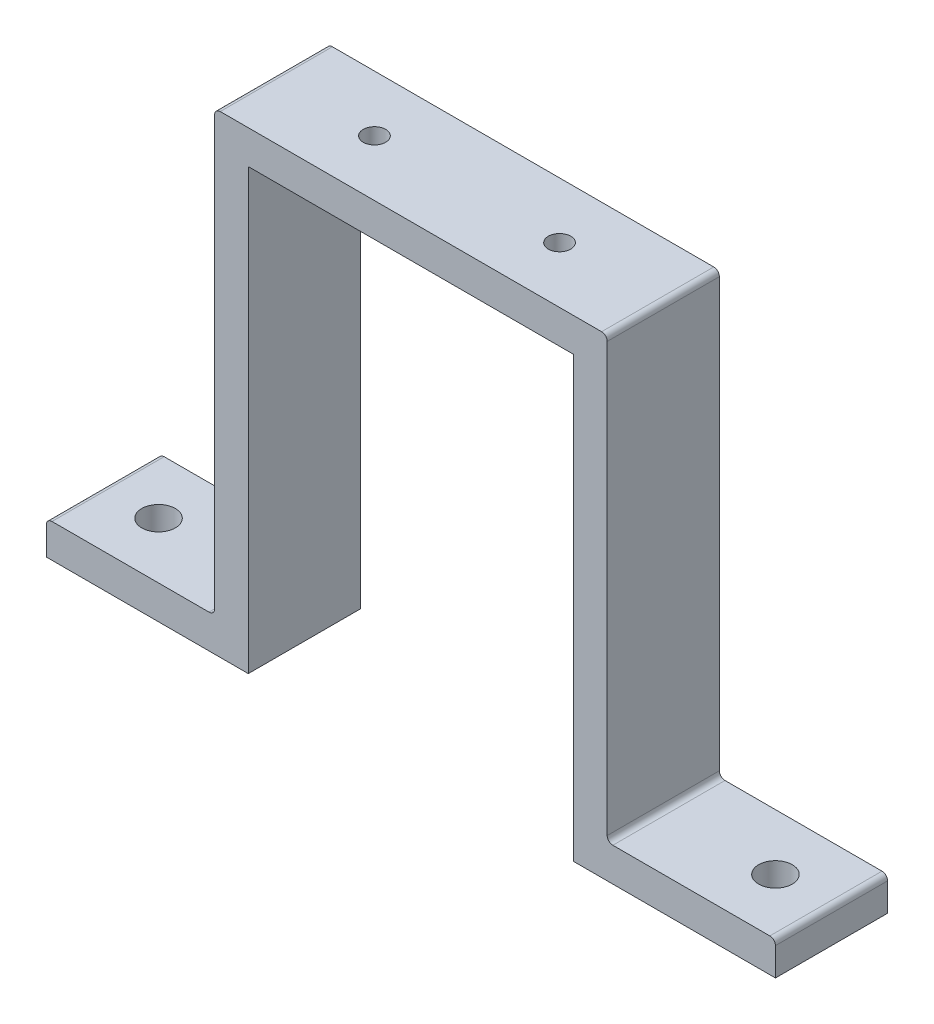
ISO-10303-21;
HEADER;
FILE_DESCRIPTION(('STEP AP214'),'2;1');
FILE_NAME('part.step','',(''),(''),'','','');
FILE_SCHEMA(('AUTOMOTIVE_DESIGN { 1 0 10303 214 1 1 1 1 }'));
ENDSEC;
DATA;
#1=APPLICATION_CONTEXT('core data for automotive mechanical design processes');
#2=APPLICATION_PROTOCOL_DEFINITION('international standard','automotive_design',2000,#1);
#3=PRODUCT_CONTEXT('',#1,'mechanical');
#4=PRODUCT('Part','Part','',(#3));
#5=PRODUCT_RELATED_PRODUCT_CATEGORY('part','',(#4));
#6=PRODUCT_DEFINITION_FORMATION('','',#4);
#7=PRODUCT_DEFINITION_CONTEXT('part definition',#1,'design');
#8=PRODUCT_DEFINITION('design','',#6,#7);
#9=PRODUCT_DEFINITION_SHAPE('','',#8);
#10=(LENGTH_UNIT() NAMED_UNIT(*) SI_UNIT(.MILLI.,.METRE.));
#11=(NAMED_UNIT(*) PLANE_ANGLE_UNIT() SI_UNIT($,.RADIAN.));
#12=(NAMED_UNIT(*) SI_UNIT($,.STERADIAN.) SOLID_ANGLE_UNIT());
#13=UNCERTAINTY_MEASURE_WITH_UNIT(LENGTH_MEASURE(1.E-05),#10,'distance_accuracy_value','');
#14=(GEOMETRIC_REPRESENTATION_CONTEXT(3) GLOBAL_UNCERTAINTY_ASSIGNED_CONTEXT((#13)) GLOBAL_UNIT_ASSIGNED_CONTEXT((#10,
#11,#12)) REPRESENTATION_CONTEXT('',''));
#15=CARTESIAN_POINT('',(0.,0.,0.));
#16=DIRECTION('',(0.,0.,1.));
#17=DIRECTION('',(1.,0.,0.));
#18=AXIS2_PLACEMENT_3D('',#15,#16,#17);
#19=CARTESIAN_POINT('',(-32.5,-36.15,10.));
#20=DIRECTION('',(1.,0.,0.));
#21=DIRECTION('',(0.,0.,-1.));
#22=AXIS2_PLACEMENT_3D('',#19,#20,#21);
#23=PLANE('',#22);
#24=DIRECTION('',(0.,-1.,0.));
#25=VECTOR('',#24,1.);
#26=CARTESIAN_POINT('',(-32.5,-36.15,10.));
#27=LINE('',#26,#25);
#28=CARTESIAN_POINT('',(-32.5,-36.65,10.));
#29=VERTEX_POINT('',#28);
#30=CARTESIAN_POINT('',(-32.5,-39.15,10.));
#31=VERTEX_POINT('',#30);
#32=EDGE_CURVE('E160',#29,#31,#27,.T.);
#33=ORIENTED_EDGE('',*,*,#32,.F.);
#34=DIRECTION('',(0.,0.,-1.));
#35=VECTOR('',#34,1.);
#36=CARTESIAN_POINT('',(-32.5,-36.65,10.));
#37=LINE('',#36,#35);
#38=CARTESIAN_POINT('',(-32.5,-36.65,0.));
#39=VERTEX_POINT('',#38);
#40=EDGE_CURVE('E186',#29,#39,#37,.T.);
#41=ORIENTED_EDGE('',*,*,#40,.T.);
#42=DIRECTION('',(0.,-1.,0.));
#43=VECTOR('',#42,1.);
#44=CARTESIAN_POINT('',(-32.5,-36.15,0.));
#45=LINE('',#44,#43);
#46=CARTESIAN_POINT('',(-32.5,-39.15,0.));
#47=VERTEX_POINT('',#46);
#48=EDGE_CURVE('E184',#39,#47,#45,.T.);
#49=ORIENTED_EDGE('',*,*,#48,.T.);
#50=DIRECTION('',(0.,0.,-1.));
#51=VECTOR('',#50,1.);
#52=CARTESIAN_POINT('',(-32.5,-39.15,10.));
#53=LINE('',#52,#51);
#54=EDGE_CURVE('E177',#31,#47,#53,.T.);
#55=ORIENTED_EDGE('',*,*,#54,.F.);
#56=EDGE_LOOP('',(#33,#41,#49,#55));
#57=FACE_BOUND('',#56,.T.);
#58=ADVANCED_FACE('F36',(#57),#23,.F.);
#59=CARTESIAN_POINT('',(-32.5,-39.15,10.));
#60=DIRECTION('',(0.,1.,0.));
#61=DIRECTION('',(0.,0.,1.));
#62=AXIS2_PLACEMENT_3D('',#59,#60,#61);
#63=PLANE('',#62);
#64=CARTESIAN_POINT('',(-27.5,-39.15,5.));
#65=DIRECTION('',(0.,1.,0.));
#66=DIRECTION('',(0.,0.,1.));
#67=AXIS2_PLACEMENT_3D('',#64,#65,#66);
#68=CIRCLE('',#67,1.5);
#69=CARTESIAN_POINT('',(-29.,-39.15,5.));
#70=VERTEX_POINT('',#69);
#71=EDGE_CURVE('E342',#70,#70,#68,.F.);
#72=ORIENTED_EDGE('',*,*,#71,.F.);
#73=EDGE_LOOP('',(#72));
#74=FACE_BOUND('',#73,.T.);
#75=DIRECTION('',(1.,0.,0.));
#76=VECTOR('',#75,1.);
#77=CARTESIAN_POINT('',(-32.5,-39.15,0.));
#78=LINE('',#77,#76);
#79=CARTESIAN_POINT('',(-14.5,-39.15,0.));
#80=VERTEX_POINT('',#79);
#81=EDGE_CURVE('E277',#47,#80,#78,.T.);
#82=ORIENTED_EDGE('',*,*,#81,.T.);
#83=DIRECTION('',(0.,0.,-1.));
#84=VECTOR('',#83,1.);
#85=CARTESIAN_POINT('',(-14.5,-39.15,10.));
#86=LINE('',#85,#84);
#87=CARTESIAN_POINT('',(-14.5,-39.15,10.));
#88=VERTEX_POINT('',#87);
#89=EDGE_CURVE('E179',#88,#80,#86,.T.);
#90=ORIENTED_EDGE('',*,*,#89,.F.);
#91=DIRECTION('',(1.,0.,0.));
#92=VECTOR('',#91,1.);
#93=CARTESIAN_POINT('',(-32.5,-39.15,10.));
#94=LINE('',#93,#92);
#95=EDGE_CURVE('E164',#31,#88,#94,.T.);
#96=ORIENTED_EDGE('',*,*,#95,.F.);
#97=ORIENTED_EDGE('',*,*,#54,.T.);
#98=EDGE_LOOP('',(#82,#90,#96,#97));
#99=FACE_BOUND('',#98,.T.);
#100=ADVANCED_FACE('F176',(#74,#99),#63,.F.);
#101=CARTESIAN_POINT('',(-14.5,-39.15,10.));
#102=DIRECTION('',(-1.,0.,0.));
#103=DIRECTION('',(0.,0.,1.));
#104=AXIS2_PLACEMENT_3D('',#101,#102,#103);
#105=PLANE('',#104);
#106=DIRECTION('',(0.,1.,0.));
#107=VECTOR('',#106,1.);
#108=CARTESIAN_POINT('',(-14.5,-39.15,0.));
#109=LINE('',#108,#107);
#110=CARTESIAN_POINT('',(-14.5,0.,0.));
#111=VERTEX_POINT('',#110);
#112=EDGE_CURVE('E280',#80,#111,#109,.T.);
#113=ORIENTED_EDGE('',*,*,#112,.T.);
#114=DIRECTION('',(0.,0.,-1.));
#115=VECTOR('',#114,1.);
#116=CARTESIAN_POINT('',(-14.5,0.,10.));
#117=LINE('',#116,#115);
#118=CARTESIAN_POINT('',(-14.5,0.,10.));
#119=VERTEX_POINT('',#118);
#120=EDGE_CURVE('E190',#119,#111,#117,.T.);
#121=ORIENTED_EDGE('',*,*,#120,.F.);
#122=DIRECTION('',(0.,1.,0.));
#123=VECTOR('',#122,1.);
#124=CARTESIAN_POINT('',(-14.5,-39.15,10.));
#125=LINE('',#124,#123);
#126=EDGE_CURVE('E181',#88,#119,#125,.T.);
#127=ORIENTED_EDGE('',*,*,#126,.F.);
#128=ORIENTED_EDGE('',*,*,#89,.T.);
#129=EDGE_LOOP('',(#113,#121,#127,#128));
#130=FACE_BOUND('',#129,.T.);
#131=ADVANCED_FACE('F373',(#130),#105,.F.);
#132=CARTESIAN_POINT('',(-14.5,0.,10.));
#133=DIRECTION('',(0.,1.,0.));
#134=DIRECTION('',(-1.,0.,0.));
#135=AXIS2_PLACEMENT_3D('',#132,#133,#134);
#136=PLANE('',#135);
#137=CARTESIAN_POINT('',(-8.25,0.,5.));
#138=DIRECTION('',(0.,1.,0.));
#139=DIRECTION('',(-1.,0.,0.));
#140=AXIS2_PLACEMENT_3D('',#137,#138,#139);
#141=CIRCLE('',#140,1.);
#142=CARTESIAN_POINT('',(-9.25,0.,5.));
#143=VERTEX_POINT('',#142);
#144=EDGE_CURVE('E278',#143,#143,#141,.F.);
#145=ORIENTED_EDGE('',*,*,#144,.F.);
#146=EDGE_LOOP('',(#145));
#147=FACE_BOUND('',#146,.T.);
#148=CARTESIAN_POINT('',(8.25,0.,5.));
#149=DIRECTION('',(0.,1.,0.));
#150=DIRECTION('',(-1.,0.,0.));
#151=AXIS2_PLACEMENT_3D('',#148,#149,#150);
#152=CIRCLE('',#151,1.);
#153=CARTESIAN_POINT('',(7.25,0.,5.));
#154=VERTEX_POINT('',#153);
#155=EDGE_CURVE('E335',#154,#154,#152,.F.);
#156=ORIENTED_EDGE('',*,*,#155,.F.);
#157=EDGE_LOOP('',(#156));
#158=FACE_BOUND('',#157,.T.);
#159=DIRECTION('',(1.,0.,0.));
#160=VECTOR('',#159,1.);
#161=CARTESIAN_POINT('',(-14.5,0.,0.));
#162=LINE('',#161,#160);
#163=CARTESIAN_POINT('',(14.5,0.,0.));
#164=VERTEX_POINT('',#163);
#165=EDGE_CURVE('E282',#111,#164,#162,.T.);
#166=ORIENTED_EDGE('',*,*,#165,.T.);
#167=DIRECTION('',(0.,0.,-1.));
#168=VECTOR('',#167,1.);
#169=CARTESIAN_POINT('',(14.5,0.,10.));
#170=LINE('',#169,#168);
#171=CARTESIAN_POINT('',(14.5,0.,10.));
#172=VERTEX_POINT('',#171);
#173=EDGE_CURVE('E303',#172,#164,#170,.T.);
#174=ORIENTED_EDGE('',*,*,#173,.F.);
#175=DIRECTION('',(1.,0.,0.));
#176=VECTOR('',#175,1.);
#177=CARTESIAN_POINT('',(-14.5,0.,10.));
#178=LINE('',#177,#176);
#179=EDGE_CURVE('E312',#119,#172,#178,.T.);
#180=ORIENTED_EDGE('',*,*,#179,.F.);
#181=ORIENTED_EDGE('',*,*,#120,.T.);
#182=EDGE_LOOP('',(#166,#174,#180,#181));
#183=FACE_BOUND('',#182,.T.);
#184=ADVANCED_FACE('F310',(#147,#158,#183),#136,.F.);
#185=CARTESIAN_POINT('',(14.5,0.,10.));
#186=DIRECTION('',(1.,0.,0.));
#187=DIRECTION('',(0.,0.,-1.));
#188=AXIS2_PLACEMENT_3D('',#185,#186,#187);
#189=PLANE('',#188);
#190=DIRECTION('',(0.,-1.,0.));
#191=VECTOR('',#190,1.);
#192=CARTESIAN_POINT('',(14.5,0.,0.));
#193=LINE('',#192,#191);
#194=CARTESIAN_POINT('',(14.5,-39.15,0.));
#195=VERTEX_POINT('',#194);
#196=EDGE_CURVE('E284',#164,#195,#193,.T.);
#197=ORIENTED_EDGE('',*,*,#196,.T.);
#198=DIRECTION('',(0.,0.,-1.));
#199=VECTOR('',#198,1.);
#200=CARTESIAN_POINT('',(14.5,-39.15,10.));
#201=LINE('',#200,#199);
#202=CARTESIAN_POINT('',(14.5,-39.15,10.));
#203=VERTEX_POINT('',#202);
#204=EDGE_CURVE('E300',#203,#195,#201,.T.);
#205=ORIENTED_EDGE('',*,*,#204,.F.);
#206=DIRECTION('',(0.,-1.,0.));
#207=VECTOR('',#206,1.);
#208=CARTESIAN_POINT('',(14.5,0.,10.));
#209=LINE('',#208,#207);
#210=EDGE_CURVE('E329',#172,#203,#209,.T.);
#211=ORIENTED_EDGE('',*,*,#210,.F.);
#212=ORIENTED_EDGE('',*,*,#173,.T.);
#213=EDGE_LOOP('',(#197,#205,#211,#212));
#214=FACE_BOUND('',#213,.T.);
#215=ADVANCED_FACE('F320',(#214),#189,.F.);
#216=CARTESIAN_POINT('',(32.5,-39.15,10.));
#217=DIRECTION('',(0.,1.,0.));
#218=DIRECTION('',(0.,0.,1.));
#219=AXIS2_PLACEMENT_3D('',#216,#217,#218);
#220=PLANE('',#219);
#221=CARTESIAN_POINT('',(27.5,-39.15,5.));
#222=DIRECTION('',(0.,1.,0.));
#223=DIRECTION('',(0.,0.,1.));
#224=AXIS2_PLACEMENT_3D('',#221,#222,#223);
#225=CIRCLE('',#224,1.5);
#226=CARTESIAN_POINT('',(26.,-39.15,5.));
#227=VERTEX_POINT('',#226);
#228=EDGE_CURVE('E351',#227,#227,#225,.F.);
#229=ORIENTED_EDGE('',*,*,#228,.F.);
#230=EDGE_LOOP('',(#229));
#231=FACE_BOUND('',#230,.T.);
#232=DIRECTION('',(1.,0.,0.));
#233=VECTOR('',#232,1.);
#234=CARTESIAN_POINT('',(32.5,-39.15,0.));
#235=LINE('',#234,#233);
#236=CARTESIAN_POINT('',(32.5,-39.15,0.));
#237=VERTEX_POINT('',#236);
#238=EDGE_CURVE('E286',#195,#237,#235,.T.);
#239=ORIENTED_EDGE('',*,*,#238,.T.);
#240=DIRECTION('',(0.,0.,-1.));
#241=VECTOR('',#240,1.);
#242=CARTESIAN_POINT('',(32.5,-39.15,10.));
#243=LINE('',#242,#241);
#244=CARTESIAN_POINT('',(32.5,-39.15,10.));
#245=VERTEX_POINT('',#244);
#246=EDGE_CURVE('E275',#245,#237,#243,.T.);
#247=ORIENTED_EDGE('',*,*,#246,.F.);
#248=DIRECTION('',(1.,0.,0.));
#249=VECTOR('',#248,1.);
#250=CARTESIAN_POINT('',(32.5,-39.15,10.));
#251=LINE('',#250,#249);
#252=EDGE_CURVE('E326',#203,#245,#251,.T.);
#253=ORIENTED_EDGE('',*,*,#252,.F.);
#254=ORIENTED_EDGE('',*,*,#204,.T.);
#255=EDGE_LOOP('',(#239,#247,#253,#254));
#256=FACE_BOUND('',#255,.T.);
#257=ADVANCED_FACE('F324',(#231,#256),#220,.F.);
#258=CARTESIAN_POINT('',(32.5,-36.15,10.));
#259=DIRECTION('',(-1.,0.,0.));
#260=DIRECTION('',(0.,0.,1.));
#261=AXIS2_PLACEMENT_3D('',#258,#259,#260);
#262=PLANE('',#261);
#263=DIRECTION('',(0.,1.,0.));
#264=VECTOR('',#263,1.);
#265=CARTESIAN_POINT('',(32.5,-36.15,0.));
#266=LINE('',#265,#264);
#267=CARTESIAN_POINT('',(32.5,-36.65,0.));
#268=VERTEX_POINT('',#267);
#269=EDGE_CURVE('E252',#237,#268,#266,.T.);
#270=ORIENTED_EDGE('',*,*,#269,.T.);
#271=DIRECTION('',(0.,0.,-1.));
#272=VECTOR('',#271,1.);
#273=CARTESIAN_POINT('',(32.5,-36.65,10.));
#274=LINE('',#273,#272);
#275=CARTESIAN_POINT('',(32.5,-36.65,10.));
#276=VERTEX_POINT('',#275);
#277=EDGE_CURVE('E217',#268,#276,#274,.F.);
#278=ORIENTED_EDGE('',*,*,#277,.T.);
#279=DIRECTION('',(0.,1.,0.));
#280=VECTOR('',#279,1.);
#281=CARTESIAN_POINT('',(32.5,-36.15,10.));
#282=LINE('',#281,#280);
#283=EDGE_CURVE('E268',#245,#276,#282,.T.);
#284=ORIENTED_EDGE('',*,*,#283,.F.);
#285=ORIENTED_EDGE('',*,*,#246,.T.);
#286=EDGE_LOOP('',(#270,#278,#284,#285));
#287=FACE_BOUND('',#286,.T.);
#288=ADVANCED_FACE('F432',(#287),#262,.F.);
#289=CARTESIAN_POINT('',(17.5,-36.15,10.));
#290=DIRECTION('',(0.,-1.,0.));
#291=DIRECTION('',(1.,0.,0.));
#292=AXIS2_PLACEMENT_3D('',#289,#290,#291);
#293=PLANE('',#292);
#294=CARTESIAN_POINT('',(27.5,-36.15,5.));
#295=DIRECTION('',(0.,1.,0.));
#296=DIRECTION('',(-1.,0.,0.));
#297=AXIS2_PLACEMENT_3D('',#294,#295,#296);
#298=CIRCLE('',#297,1.5);
#299=CARTESIAN_POINT('',(26.,-36.15,5.));
#300=VERTEX_POINT('',#299);
#301=EDGE_CURVE('E347',#300,#300,#298,.T.);
#302=ORIENTED_EDGE('',*,*,#301,.F.);
#303=EDGE_LOOP('',(#302));
#304=FACE_BOUND('',#303,.T.);
#305=DIRECTION('',(-1.,0.,0.));
#306=VECTOR('',#305,1.);
#307=CARTESIAN_POINT('',(17.5,-36.15,10.));
#308=LINE('',#307,#306);
#309=CARTESIAN_POINT('',(32.,-36.15,10.));
#310=VERTEX_POINT('',#309);
#311=CARTESIAN_POINT('',(18.,-36.15,10.));
#312=VERTEX_POINT('',#311);
#313=EDGE_CURVE('E260',#310,#312,#308,.T.);
#314=ORIENTED_EDGE('',*,*,#313,.F.);
#315=DIRECTION('',(0.,0.,-1.));
#316=VECTOR('',#315,1.);
#317=CARTESIAN_POINT('',(32.,-36.15,10.));
#318=LINE('',#317,#316);
#319=CARTESIAN_POINT('',(32.,-36.15,0.));
#320=VERTEX_POINT('',#319);
#321=EDGE_CURVE('E214',#310,#320,#318,.T.);
#322=ORIENTED_EDGE('',*,*,#321,.T.);
#323=DIRECTION('',(-1.,0.,0.));
#324=VECTOR('',#323,1.);
#325=CARTESIAN_POINT('',(17.5,-36.15,0.));
#326=LINE('',#325,#324);
#327=CARTESIAN_POINT('',(18.,-36.15,0.));
#328=VERTEX_POINT('',#327);
#329=EDGE_CURVE('E241',#320,#328,#326,.T.);
#330=ORIENTED_EDGE('',*,*,#329,.T.);
#331=DIRECTION('',(0.,0.,-1.));
#332=VECTOR('',#331,1.);
#333=CARTESIAN_POINT('',(18.,-36.15,10.));
#334=LINE('',#333,#332);
#335=EDGE_CURVE('E212',#328,#312,#334,.F.);
#336=ORIENTED_EDGE('',*,*,#335,.T.);
#337=EDGE_LOOP('',(#314,#322,#330,#336));
#338=FACE_BOUND('',#337,.T.);
#339=ADVANCED_FACE('F249',(#304,#338),#293,.F.);
#340=CARTESIAN_POINT('',(17.5,3.,10.));
#341=DIRECTION('',(-1.,0.,0.));
#342=DIRECTION('',(0.,-1.,0.));
#343=AXIS2_PLACEMENT_3D('',#340,#341,#342);
#344=PLANE('',#343);
#345=DIRECTION('',(0.,1.,0.));
#346=VECTOR('',#345,1.);
#347=CARTESIAN_POINT('',(17.5,3.,10.));
#348=LINE('',#347,#346);
#349=CARTESIAN_POINT('',(17.5,-35.65,10.));
#350=VERTEX_POINT('',#349);
#351=CARTESIAN_POINT('',(17.5,2.5,10.));
#352=VERTEX_POINT('',#351);
#353=EDGE_CURVE('E258',#350,#352,#348,.T.);
#354=ORIENTED_EDGE('',*,*,#353,.F.);
#355=DIRECTION('',(0.,0.,-1.));
#356=VECTOR('',#355,1.);
#357=CARTESIAN_POINT('',(17.5,-35.65,0.));
#358=LINE('',#357,#356);
#359=CARTESIAN_POINT('',(17.5,-35.65,0.));
#360=VERTEX_POINT('',#359);
#361=EDGE_CURVE('E230',#350,#360,#358,.T.);
#362=ORIENTED_EDGE('',*,*,#361,.T.);
#363=DIRECTION('',(0.,1.,0.));
#364=VECTOR('',#363,1.);
#365=CARTESIAN_POINT('',(17.5,3.,0.));
#366=LINE('',#365,#364);
#367=CARTESIAN_POINT('',(17.5,2.5,0.));
#368=VERTEX_POINT('',#367);
#369=EDGE_CURVE('E243',#360,#368,#366,.T.);
#370=ORIENTED_EDGE('',*,*,#369,.T.);
#371=DIRECTION('',(0.,0.,-1.));
#372=VECTOR('',#371,1.);
#373=CARTESIAN_POINT('',(17.5,2.5,10.));
#374=LINE('',#373,#372);
#375=EDGE_CURVE('E228',#368,#352,#374,.F.);
#376=ORIENTED_EDGE('',*,*,#375,.T.);
#377=EDGE_LOOP('',(#354,#362,#370,#376));
#378=FACE_BOUND('',#377,.T.);
#379=ADVANCED_FACE('F262',(#378),#344,.F.);
#380=CARTESIAN_POINT('',(17.5,3.,10.));
#381=DIRECTION('',(0.,-1.,0.));
#382=DIRECTION('',(0.,0.,-1.));
#383=AXIS2_PLACEMENT_3D('',#380,#381,#382);
#384=PLANE('',#383);
#385=CARTESIAN_POINT('',(-8.25,2.99999999999999,5.));
#386=DIRECTION('',(0.,1.,0.));
#387=DIRECTION('',(-1.,0.,0.));
#388=AXIS2_PLACEMENT_3D('',#385,#386,#387);
#389=CIRCLE('',#388,1.);
#390=CARTESIAN_POINT('',(-9.25,2.99999999999999,5.));
#391=VERTEX_POINT('',#390);
#392=EDGE_CURVE('E338',#391,#391,#389,.T.);
#393=ORIENTED_EDGE('',*,*,#392,.F.);
#394=EDGE_LOOP('',(#393));
#395=FACE_BOUND('',#394,.T.);
#396=CARTESIAN_POINT('',(8.25,3.,5.));
#397=DIRECTION('',(0.,1.,0.));
#398=DIRECTION('',(-1.,0.,0.));
#399=AXIS2_PLACEMENT_3D('',#396,#397,#398);
#400=CIRCLE('',#399,1.);
#401=CARTESIAN_POINT('',(7.25,3.,5.));
#402=VERTEX_POINT('',#401);
#403=EDGE_CURVE('E339',#402,#402,#400,.T.);
#404=ORIENTED_EDGE('',*,*,#403,.F.);
#405=EDGE_LOOP('',(#404));
#406=FACE_BOUND('',#405,.T.);
#407=DIRECTION('',(-1.,0.,0.));
#408=VECTOR('',#407,1.);
#409=CARTESIAN_POINT('',(17.5,3.,0.));
#410=LINE('',#409,#408);
#411=CARTESIAN_POINT('',(17.,3.,0.));
#412=VERTEX_POINT('',#411);
#413=CARTESIAN_POINT('',(-17.,3.,0.));
#414=VERTEX_POINT('',#413);
#415=EDGE_CURVE('E291',#412,#414,#410,.T.);
#416=ORIENTED_EDGE('',*,*,#415,.T.);
#417=DIRECTION('',(0.,0.,-1.));
#418=VECTOR('',#417,1.);
#419=CARTESIAN_POINT('',(-17.,3.,10.));
#420=LINE('',#419,#418);
#421=CARTESIAN_POINT('',(-17.,3.,10.));
#422=VERTEX_POINT('',#421);
#423=EDGE_CURVE('E226',#414,#422,#420,.F.);
#424=ORIENTED_EDGE('',*,*,#423,.T.);
#425=DIRECTION('',(-1.,0.,0.));
#426=VECTOR('',#425,1.);
#427=CARTESIAN_POINT('',(17.5,3.,10.));
#428=LINE('',#427,#426);
#429=CARTESIAN_POINT('',(17.,3.,10.));
#430=VERTEX_POINT('',#429);
#431=EDGE_CURVE('E264',#430,#422,#428,.T.);
#432=ORIENTED_EDGE('',*,*,#431,.F.);
#433=DIRECTION('',(0.,0.,-1.));
#434=VECTOR('',#433,1.);
#435=CARTESIAN_POINT('',(17.,3.,10.));
#436=LINE('',#435,#434);
#437=EDGE_CURVE('E223',#430,#412,#436,.T.);
#438=ORIENTED_EDGE('',*,*,#437,.T.);
#439=EDGE_LOOP('',(#416,#424,#432,#438));
#440=FACE_BOUND('',#439,.T.);
#441=ADVANCED_FACE('F413',(#395,#406,#440),#384,.F.);
#442=CARTESIAN_POINT('',(-17.5,3.,10.));
#443=DIRECTION('',(1.,0.,0.));
#444=DIRECTION('',(0.,1.,0.));
#445=AXIS2_PLACEMENT_3D('',#442,#443,#444);
#446=PLANE('',#445);
#447=DIRECTION('',(0.,-1.,0.));
#448=VECTOR('',#447,1.);
#449=CARTESIAN_POINT('',(-17.5,3.,0.));
#450=LINE('',#449,#448);
#451=CARTESIAN_POINT('',(-17.5,2.5,0.));
#452=VERTEX_POINT('',#451);
#453=CARTESIAN_POINT('',(-17.5,-35.65,0.));
#454=VERTEX_POINT('',#453);
#455=EDGE_CURVE('E294',#452,#454,#450,.T.);
#456=ORIENTED_EDGE('',*,*,#455,.T.);
#457=DIRECTION('',(0.,0.,-1.));
#458=VECTOR('',#457,1.);
#459=CARTESIAN_POINT('',(-17.5,-35.65,10.));
#460=LINE('',#459,#458);
#461=CARTESIAN_POINT('',(-17.5,-35.65,10.));
#462=VERTEX_POINT('',#461);
#463=EDGE_CURVE('E51',#454,#462,#460,.F.);
#464=ORIENTED_EDGE('',*,*,#463,.T.);
#465=DIRECTION('',(0.,-1.,0.));
#466=VECTOR('',#465,1.);
#467=CARTESIAN_POINT('',(-17.5,3.,10.));
#468=LINE('',#467,#466);
#469=CARTESIAN_POINT('',(-17.5,2.5,10.));
#470=VERTEX_POINT('',#469);
#471=EDGE_CURVE('E266',#470,#462,#468,.T.);
#472=ORIENTED_EDGE('',*,*,#471,.F.);
#473=DIRECTION('',(0.,0.,-1.));
#474=VECTOR('',#473,1.);
#475=CARTESIAN_POINT('',(-17.5,2.5,10.));
#476=LINE('',#475,#474);
#477=EDGE_CURVE('E219',#470,#452,#476,.T.);
#478=ORIENTED_EDGE('',*,*,#477,.T.);
#479=EDGE_LOOP('',(#456,#464,#472,#478));
#480=FACE_BOUND('',#479,.T.);
#481=ADVANCED_FACE('F365',(#480),#446,.F.);
#482=CARTESIAN_POINT('',(-17.5,-36.15,10.));
#483=DIRECTION('',(0.,-1.,0.));
#484=DIRECTION('',(1.,0.,0.));
#485=AXIS2_PLACEMENT_3D('',#482,#483,#484);
#486=PLANE('',#485);
#487=CARTESIAN_POINT('',(-27.5,-36.15,5.));
#488=DIRECTION('',(0.,1.,0.));
#489=DIRECTION('',(-1.,0.,0.));
#490=AXIS2_PLACEMENT_3D('',#487,#488,#489);
#491=CIRCLE('',#490,1.5);
#492=CARTESIAN_POINT('',(-29.,-36.15,5.));
#493=VERTEX_POINT('',#492);
#494=EDGE_CURVE('E350',#493,#493,#491,.T.);
#495=ORIENTED_EDGE('',*,*,#494,.F.);
#496=EDGE_LOOP('',(#495));
#497=FACE_BOUND('',#496,.T.);
#498=DIRECTION('',(-1.,0.,0.));
#499=VECTOR('',#498,1.);
#500=CARTESIAN_POINT('',(-17.5,-36.15,0.));
#501=LINE('',#500,#499);
#502=CARTESIAN_POINT('',(-18.,-36.15,0.));
#503=VERTEX_POINT('',#502);
#504=CARTESIAN_POINT('',(-32.,-36.15,0.));
#505=VERTEX_POINT('',#504);
#506=EDGE_CURVE('E172',#503,#505,#501,.T.);
#507=ORIENTED_EDGE('',*,*,#506,.T.);
#508=DIRECTION('',(0.,0.,-1.));
#509=VECTOR('',#508,1.);
#510=CARTESIAN_POINT('',(-32.,-36.15,10.));
#511=LINE('',#510,#509);
#512=CARTESIAN_POINT('',(-32.,-36.15,10.));
#513=VERTEX_POINT('',#512);
#514=EDGE_CURVE('E204',#505,#513,#511,.F.);
#515=ORIENTED_EDGE('',*,*,#514,.T.);
#516=DIRECTION('',(-1.,0.,0.));
#517=VECTOR('',#516,1.);
#518=CARTESIAN_POINT('',(-17.5,-36.15,10.));
#519=LINE('',#518,#517);
#520=CARTESIAN_POINT('',(-18.,-36.15,10.));
#521=VERTEX_POINT('',#520);
#522=EDGE_CURVE('E273',#521,#513,#519,.T.);
#523=ORIENTED_EDGE('',*,*,#522,.F.);
#524=DIRECTION('',(0.,0.,-1.));
#525=VECTOR('',#524,1.);
#526=CARTESIAN_POINT('',(-18.,-36.15,0.));
#527=LINE('',#526,#525);
#528=EDGE_CURVE('E201',#521,#503,#527,.T.);
#529=ORIENTED_EDGE('',*,*,#528,.T.);
#530=EDGE_LOOP('',(#507,#515,#523,#529));
#531=FACE_BOUND('',#530,.T.);
#532=ADVANCED_FACE('F362',(#497,#531),#486,.F.);
#533=CARTESIAN_POINT('',(0.,0.,10.));
#534=DIRECTION('',(0.,0.,1.));
#535=DIRECTION('',(1.,0.,0.));
#536=AXIS2_PLACEMENT_3D('',#533,#534,#535);
#537=PLANE('',#536);
#538=ORIENTED_EDGE('',*,*,#522,.T.);
#539=CARTESIAN_POINT('',(-32.,-36.65,10.));
#540=DIRECTION('',(0.,0.,1.));
#541=DIRECTION('',(1.,0.,0.));
#542=AXIS2_PLACEMENT_3D('',#539,#540,#541);
#543=CIRCLE('',#542,0.5);
#544=EDGE_CURVE('E167',#513,#29,#543,.T.);
#545=ORIENTED_EDGE('',*,*,#544,.T.);
#546=ORIENTED_EDGE('',*,*,#32,.T.);
#547=ORIENTED_EDGE('',*,*,#95,.T.);
#548=ORIENTED_EDGE('',*,*,#126,.T.);
#549=ORIENTED_EDGE('',*,*,#179,.T.);
#550=ORIENTED_EDGE('',*,*,#210,.T.);
#551=ORIENTED_EDGE('',*,*,#252,.T.);
#552=ORIENTED_EDGE('',*,*,#283,.T.);
#553=CARTESIAN_POINT('',(32.,-36.65,10.));
#554=DIRECTION('',(0.,0.,1.));
#555=DIRECTION('',(1.,0.,0.));
#556=AXIS2_PLACEMENT_3D('',#553,#554,#555);
#557=CIRCLE('',#556,0.5);
#558=EDGE_CURVE('E209',#276,#310,#557,.T.);
#559=ORIENTED_EDGE('',*,*,#558,.T.);
#560=ORIENTED_EDGE('',*,*,#313,.T.);
#561=CARTESIAN_POINT('',(18.,-35.65,10.));
#562=DIRECTION('',(0.,0.,1.));
#563=DIRECTION('',(1.,0.,0.));
#564=AXIS2_PLACEMENT_3D('',#561,#562,#563);
#565=CIRCLE('',#564,0.5);
#566=EDGE_CURVE('E11',#312,#350,#565,.F.);
#567=ORIENTED_EDGE('',*,*,#566,.T.);
#568=ORIENTED_EDGE('',*,*,#353,.T.);
#569=CARTESIAN_POINT('',(17.,2.5,10.));
#570=DIRECTION('',(0.,0.,1.));
#571=DIRECTION('',(1.,0.,0.));
#572=AXIS2_PLACEMENT_3D('',#569,#570,#571);
#573=CIRCLE('',#572,0.5);
#574=EDGE_CURVE('E206',#352,#430,#573,.T.);
#575=ORIENTED_EDGE('',*,*,#574,.T.);
#576=ORIENTED_EDGE('',*,*,#431,.T.);
#577=CARTESIAN_POINT('',(-17.,2.5,10.));
#578=DIRECTION('',(0.,0.,1.));
#579=DIRECTION('',(1.,0.,0.));
#580=AXIS2_PLACEMENT_3D('',#577,#578,#579);
#581=CIRCLE('',#580,0.5);
#582=EDGE_CURVE('E58',#422,#470,#581,.T.);
#583=ORIENTED_EDGE('',*,*,#582,.T.);
#584=ORIENTED_EDGE('',*,*,#471,.T.);
#585=CARTESIAN_POINT('',(-18.,-35.65,10.));
#586=DIRECTION('',(0.,0.,1.));
#587=DIRECTION('',(1.,0.,0.));
#588=AXIS2_PLACEMENT_3D('',#585,#586,#587);
#589=CIRCLE('',#588,0.5);
#590=EDGE_CURVE('E235',#462,#521,#589,.F.);
#591=ORIENTED_EDGE('',*,*,#590,.T.);
#592=EDGE_LOOP('',(#538,#545,#546,#547,#548,#549,#550,#551,#552,#559,#560,#567,#568,#575,#576,
#583,#584,#591));
#593=FACE_BOUND('',#592,.T.);
#594=ADVANCED_FACE('F163',(#593),#537,.T.);
#595=CARTESIAN_POINT('',(0.,0.,0.));
#596=DIRECTION('',(0.,0.,1.));
#597=DIRECTION('',(1.,0.,0.));
#598=AXIS2_PLACEMENT_3D('',#595,#596,#597);
#599=PLANE('',#598);
#600=ORIENTED_EDGE('',*,*,#48,.F.);
#601=CARTESIAN_POINT('',(-32.,-36.65,0.));
#602=DIRECTION('',(0.,0.,1.));
#603=DIRECTION('',(1.,0.,0.));
#604=AXIS2_PLACEMENT_3D('',#601,#602,#603);
#605=CIRCLE('',#604,0.5);
#606=EDGE_CURVE('E199',#39,#505,#605,.F.);
#607=ORIENTED_EDGE('',*,*,#606,.T.);
#608=ORIENTED_EDGE('',*,*,#506,.F.);
#609=CARTESIAN_POINT('',(-18.,-35.65,0.));
#610=DIRECTION('',(0.,0.,1.));
#611=DIRECTION('',(1.,0.,0.));
#612=AXIS2_PLACEMENT_3D('',#609,#610,#611);
#613=CIRCLE('',#612,0.5);
#614=EDGE_CURVE('E233',#503,#454,#613,.T.);
#615=ORIENTED_EDGE('',*,*,#614,.T.);
#616=ORIENTED_EDGE('',*,*,#455,.F.);
#617=CARTESIAN_POINT('',(-17.,2.5,0.));
#618=DIRECTION('',(0.,0.,1.));
#619=DIRECTION('',(1.,0.,0.));
#620=AXIS2_PLACEMENT_3D('',#617,#618,#619);
#621=CIRCLE('',#620,0.5);
#622=EDGE_CURVE('E195',#452,#414,#621,.F.);
#623=ORIENTED_EDGE('',*,*,#622,.T.);
#624=ORIENTED_EDGE('',*,*,#415,.F.);
#625=CARTESIAN_POINT('',(17.,2.5,0.));
#626=DIRECTION('',(0.,0.,1.));
#627=DIRECTION('',(1.,0.,0.));
#628=AXIS2_PLACEMENT_3D('',#625,#626,#627);
#629=CIRCLE('',#628,0.5);
#630=EDGE_CURVE('E188',#412,#368,#629,.F.);
#631=ORIENTED_EDGE('',*,*,#630,.T.);
#632=ORIENTED_EDGE('',*,*,#369,.F.);
#633=CARTESIAN_POINT('',(18.,-35.65,0.));
#634=DIRECTION('',(0.,0.,1.));
#635=DIRECTION('',(1.,0.,0.));
#636=AXIS2_PLACEMENT_3D('',#633,#634,#635);
#637=CIRCLE('',#636,0.5);
#638=EDGE_CURVE('E44',#360,#328,#637,.T.);
#639=ORIENTED_EDGE('',*,*,#638,.T.);
#640=ORIENTED_EDGE('',*,*,#329,.F.);
#641=CARTESIAN_POINT('',(32.,-36.65,0.));
#642=DIRECTION('',(0.,0.,1.));
#643=DIRECTION('',(1.,0.,0.));
#644=AXIS2_PLACEMENT_3D('',#641,#642,#643);
#645=CIRCLE('',#644,0.5);
#646=EDGE_CURVE('E197',#320,#268,#645,.F.);
#647=ORIENTED_EDGE('',*,*,#646,.T.);
#648=ORIENTED_EDGE('',*,*,#269,.F.);
#649=ORIENTED_EDGE('',*,*,#238,.F.);
#650=ORIENTED_EDGE('',*,*,#196,.F.);
#651=ORIENTED_EDGE('',*,*,#165,.F.);
#652=ORIENTED_EDGE('',*,*,#112,.F.);
#653=ORIENTED_EDGE('',*,*,#81,.F.);
#654=EDGE_LOOP('',(#600,#607,#608,#615,#616,#623,#624,#631,#632,#639,#640,#647,#648,#649,#650,
#651,#652,#653));
#655=FACE_BOUND('',#654,.T.);
#656=ADVANCED_FACE('F240',(#655),#599,.F.);
#657=CARTESIAN_POINT('',(8.25000000000001,-39.151,5.));
#658=DIRECTION('',(0.,1.,0.));
#659=DIRECTION('',(-1.,0.,0.));
#660=AXIS2_PLACEMENT_3D('',#657,#658,#659);
#661=CYLINDRICAL_SURFACE('',#660,1.);
#662=ORIENTED_EDGE('',*,*,#403,.T.);
#663=EDGE_LOOP('',(#662));
#664=FACE_BOUND('',#663,.T.);
#665=ORIENTED_EDGE('',*,*,#155,.T.);
#666=EDGE_LOOP('',(#665));
#667=FACE_BOUND('',#666,.T.);
#668=ADVANCED_FACE('F494',(#664,#667),#661,.F.);
#669=CARTESIAN_POINT('',(-8.24999999999999,-39.151,5.));
#670=DIRECTION('',(0.,1.,0.));
#671=DIRECTION('',(-1.,0.,0.));
#672=AXIS2_PLACEMENT_3D('',#669,#670,#671);
#673=CYLINDRICAL_SURFACE('',#672,1.);
#674=ORIENTED_EDGE('',*,*,#392,.T.);
#675=EDGE_LOOP('',(#674));
#676=FACE_BOUND('',#675,.T.);
#677=ORIENTED_EDGE('',*,*,#144,.T.);
#678=EDGE_LOOP('',(#677));
#679=FACE_BOUND('',#678,.T.);
#680=ADVANCED_FACE('F541',(#676,#679),#673,.F.);
#681=CARTESIAN_POINT('',(-27.5,-39.1510000000001,5.));
#682=DIRECTION('',(0.,1.,0.));
#683=DIRECTION('',(-1.,0.,0.));
#684=AXIS2_PLACEMENT_3D('',#681,#682,#683);
#685=CYLINDRICAL_SURFACE('',#684,1.5);
#686=CARTESIAN_POINT('',(-29.,-36.15,5.));
#687=CARTESIAN_POINT('',(-29.,-36.18125,5.));
#688=CARTESIAN_POINT('',(-29.,-36.2125,5.));
#689=CARTESIAN_POINT('',(-29.,-36.275,5.));
#690=CARTESIAN_POINT('',(-29.,-36.30625,5.));
#691=CARTESIAN_POINT('',(-29.,-36.36875,5.));
#692=CARTESIAN_POINT('',(-29.,-36.4,5.));
#693=CARTESIAN_POINT('',(-29.,-36.4625,5.));
#694=CARTESIAN_POINT('',(-29.,-36.49375,5.));
#695=CARTESIAN_POINT('',(-29.,-36.55625,5.));
#696=CARTESIAN_POINT('',(-29.,-36.5875,5.));
#697=CARTESIAN_POINT('',(-29.,-36.65,5.));
#698=CARTESIAN_POINT('',(-29.,-36.68125,5.));
#699=CARTESIAN_POINT('',(-29.,-36.74375,5.));
#700=CARTESIAN_POINT('',(-29.,-36.775,5.));
#701=CARTESIAN_POINT('',(-29.,-36.8375,5.));
#702=CARTESIAN_POINT('',(-29.,-36.86875,5.));
#703=CARTESIAN_POINT('',(-29.,-36.93125,5.));
#704=CARTESIAN_POINT('',(-29.,-36.9625,5.));
#705=CARTESIAN_POINT('',(-29.,-37.025,5.));
#706=CARTESIAN_POINT('',(-29.,-37.05625,5.));
#707=CARTESIAN_POINT('',(-29.,-37.11875,5.));
#708=CARTESIAN_POINT('',(-29.,-37.15,5.));
#709=CARTESIAN_POINT('',(-29.,-37.2125,5.));
#710=CARTESIAN_POINT('',(-29.,-37.24375,5.));
#711=CARTESIAN_POINT('',(-29.,-37.30625,5.));
#712=CARTESIAN_POINT('',(-29.,-37.3375,5.));
#713=CARTESIAN_POINT('',(-29.,-37.4,5.));
#714=CARTESIAN_POINT('',(-29.,-37.43125,5.));
#715=CARTESIAN_POINT('',(-29.,-37.49375,5.));
#716=CARTESIAN_POINT('',(-29.,-37.525,5.));
#717=CARTESIAN_POINT('',(-29.,-37.5875,5.));
#718=CARTESIAN_POINT('',(-29.,-37.61875,5.));
#719=CARTESIAN_POINT('',(-29.,-37.68125,5.));
#720=CARTESIAN_POINT('',(-29.,-37.7125,5.));
#721=CARTESIAN_POINT('',(-29.,-37.775,5.));
#722=CARTESIAN_POINT('',(-29.,-37.80625,5.));
#723=CARTESIAN_POINT('',(-29.,-37.86875,5.));
#724=CARTESIAN_POINT('',(-29.,-37.9,5.));
#725=CARTESIAN_POINT('',(-29.,-37.9625,5.));
#726=CARTESIAN_POINT('',(-29.,-37.99375,5.));
#727=CARTESIAN_POINT('',(-29.,-38.05625,5.));
#728=CARTESIAN_POINT('',(-29.,-38.0875,5.));
#729=CARTESIAN_POINT('',(-29.,-38.15,5.));
#730=CARTESIAN_POINT('',(-29.,-38.18125,5.));
#731=CARTESIAN_POINT('',(-29.,-38.24375,5.));
#732=CARTESIAN_POINT('',(-29.,-38.275,5.));
#733=CARTESIAN_POINT('',(-29.,-38.3375,5.));
#734=CARTESIAN_POINT('',(-29.,-38.36875,5.));
#735=CARTESIAN_POINT('',(-29.,-38.43125,5.));
#736=CARTESIAN_POINT('',(-29.,-38.4625,5.));
#737=CARTESIAN_POINT('',(-29.,-38.525,5.));
#738=CARTESIAN_POINT('',(-29.,-38.55625,5.));
#739=CARTESIAN_POINT('',(-29.,-38.61875,5.));
#740=CARTESIAN_POINT('',(-29.,-38.65,5.));
#741=CARTESIAN_POINT('',(-29.,-38.7125,5.));
#742=CARTESIAN_POINT('',(-29.,-38.74375,5.));
#743=CARTESIAN_POINT('',(-29.,-38.80625,5.));
#744=CARTESIAN_POINT('',(-29.,-38.8375,5.));
#745=CARTESIAN_POINT('',(-29.,-38.9,5.));
#746=CARTESIAN_POINT('',(-29.,-38.93125,5.));
#747=CARTESIAN_POINT('',(-29.,-38.99375,5.));
#748=CARTESIAN_POINT('',(-29.,-39.025,5.));
#749=CARTESIAN_POINT('',(-29.,-39.0875,5.));
#750=CARTESIAN_POINT('',(-29.,-39.11875,5.));
#751=CARTESIAN_POINT('',(-29.,-39.15,5.));
#752=B_SPLINE_CURVE_WITH_KNOTS('',3,(#686,#687,#688,#689,#690,#691,#692,#693,#694,#695,#696,
#697,#698,#699,#700,#701,#702,#703,#704,#705,#706,#707,#708,#709,#710,#711,#712,#713,#714,#715,
#716,#717,#718,#719,#720,#721,#722,#723,#724,#725,#726,#727,#728,#729,#730,#731,#732,#733,#734,
#735,#736,#737,#738,#739,#740,#741,#742,#743,#744,#745,#746,#747,#748,#749,#750,#751),
.UNSPECIFIED.,.F.,.F.,(4,2,2,2,2,2,2,2,2,2,2,2,2,2,2,2,2,2,2,2,2,2,2,2,2,2,2,2,2,2,2,2,4),(0.,
0.0937500000000036,0.1875,0.281250000000004,0.375,0.468749999999997,0.5625,0.656249999999997,
0.749999999999994,0.843749999999997,0.937499999999994,1.03125,1.12499999999999,1.21874999999999,
1.31249999999999,1.40624999999999,1.49999999999999,1.59374999999999,1.68749999999999,
1.78124999999999,1.87499999999999,1.96874999999998,2.06249999999999,2.15624999999998,
2.24999999999999,2.34374999999998,2.43749999999998,2.53124999999998,2.62499999999998,
2.71874999999998,2.81249999999998,2.90624999999998,2.99999999999998),.UNSPECIFIED.);
#753=EDGE_CURVE('BSEAM359',#493,#70,#752,.T.);
#754=ORIENTED_EDGE('',*,*,#494,.T.);
#755=ORIENTED_EDGE('',*,*,#71,.T.);
#756=ORIENTED_EDGE('',*,*,#753,.T.);
#757=ORIENTED_EDGE('',*,*,#753,.F.);
#758=EDGE_LOOP('',(#754,#756,#755,#757));
#759=FACE_BOUND('',#758,.T.);
#760=ADVANCED_FACE('F359',(#759),#685,.F.);
#761=CARTESIAN_POINT('',(27.5,-39.151,5.));
#762=DIRECTION('',(0.,1.,0.));
#763=DIRECTION('',(-1.,0.,0.));
#764=AXIS2_PLACEMENT_3D('',#761,#762,#763);
#765=CYLINDRICAL_SURFACE('',#764,1.5);
#766=CARTESIAN_POINT('',(26.,-36.15,5.));
#767=CARTESIAN_POINT('',(26.,-36.18125,5.));
#768=CARTESIAN_POINT('',(26.,-36.2125,5.));
#769=CARTESIAN_POINT('',(26.,-36.275,5.));
#770=CARTESIAN_POINT('',(26.,-36.30625,5.));
#771=CARTESIAN_POINT('',(26.,-36.36875,5.));
#772=CARTESIAN_POINT('',(26.,-36.4,5.));
#773=CARTESIAN_POINT('',(26.,-36.4625,5.));
#774=CARTESIAN_POINT('',(26.,-36.49375,5.));
#775=CARTESIAN_POINT('',(26.,-36.55625,5.));
#776=CARTESIAN_POINT('',(26.,-36.5875,5.));
#777=CARTESIAN_POINT('',(26.,-36.65,5.));
#778=CARTESIAN_POINT('',(26.,-36.68125,5.));
#779=CARTESIAN_POINT('',(26.,-36.74375,5.));
#780=CARTESIAN_POINT('',(26.,-36.775,5.));
#781=CARTESIAN_POINT('',(26.,-36.8375,5.));
#782=CARTESIAN_POINT('',(26.,-36.86875,5.));
#783=CARTESIAN_POINT('',(26.,-36.93125,5.));
#784=CARTESIAN_POINT('',(26.,-36.9625,5.));
#785=CARTESIAN_POINT('',(26.,-37.025,5.));
#786=CARTESIAN_POINT('',(26.,-37.05625,5.));
#787=CARTESIAN_POINT('',(26.,-37.11875,5.));
#788=CARTESIAN_POINT('',(26.,-37.15,5.));
#789=CARTESIAN_POINT('',(26.,-37.2125,5.));
#790=CARTESIAN_POINT('',(26.,-37.24375,5.));
#791=CARTESIAN_POINT('',(26.,-37.30625,5.));
#792=CARTESIAN_POINT('',(26.,-37.3375,5.));
#793=CARTESIAN_POINT('',(26.,-37.4,5.));
#794=CARTESIAN_POINT('',(26.,-37.43125,5.));
#795=CARTESIAN_POINT('',(26.,-37.49375,5.));
#796=CARTESIAN_POINT('',(26.,-37.525,5.));
#797=CARTESIAN_POINT('',(26.,-37.5875,5.));
#798=CARTESIAN_POINT('',(26.,-37.61875,5.));
#799=CARTESIAN_POINT('',(26.,-37.68125,5.));
#800=CARTESIAN_POINT('',(26.,-37.7125,5.));
#801=CARTESIAN_POINT('',(26.,-37.775,5.));
#802=CARTESIAN_POINT('',(26.,-37.80625,5.));
#803=CARTESIAN_POINT('',(26.,-37.86875,5.));
#804=CARTESIAN_POINT('',(26.,-37.9,5.));
#805=CARTESIAN_POINT('',(26.,-37.9625,5.));
#806=CARTESIAN_POINT('',(26.,-37.99375,5.));
#807=CARTESIAN_POINT('',(26.,-38.05625,5.));
#808=CARTESIAN_POINT('',(26.,-38.0875,5.));
#809=CARTESIAN_POINT('',(26.,-38.15,5.));
#810=CARTESIAN_POINT('',(26.,-38.18125,5.));
#811=CARTESIAN_POINT('',(26.,-38.24375,5.));
#812=CARTESIAN_POINT('',(26.,-38.275,5.));
#813=CARTESIAN_POINT('',(26.,-38.3375,5.));
#814=CARTESIAN_POINT('',(26.,-38.36875,5.));
#815=CARTESIAN_POINT('',(26.,-38.43125,5.));
#816=CARTESIAN_POINT('',(26.,-38.4625,5.));
#817=CARTESIAN_POINT('',(26.,-38.525,5.));
#818=CARTESIAN_POINT('',(26.,-38.55625,5.));
#819=CARTESIAN_POINT('',(26.,-38.61875,5.));
#820=CARTESIAN_POINT('',(26.,-38.65,5.));
#821=CARTESIAN_POINT('',(26.,-38.7125,5.));
#822=CARTESIAN_POINT('',(26.,-38.74375,5.));
#823=CARTESIAN_POINT('',(26.,-38.80625,5.));
#824=CARTESIAN_POINT('',(26.,-38.8375,5.));
#825=CARTESIAN_POINT('',(26.,-38.9,5.));
#826=CARTESIAN_POINT('',(26.,-38.93125,5.));
#827=CARTESIAN_POINT('',(26.,-38.99375,5.));
#828=CARTESIAN_POINT('',(26.,-39.025,5.));
#829=CARTESIAN_POINT('',(26.,-39.0875,5.));
#830=CARTESIAN_POINT('',(26.,-39.11875,5.));
#831=CARTESIAN_POINT('',(26.,-39.15,5.));
#832=B_SPLINE_CURVE_WITH_KNOTS('',3,(#766,#767,#768,#769,#770,#771,#772,#773,#774,#775,#776,
#777,#778,#779,#780,#781,#782,#783,#784,#785,#786,#787,#788,#789,#790,#791,#792,#793,#794,#795,
#796,#797,#798,#799,#800,#801,#802,#803,#804,#805,#806,#807,#808,#809,#810,#811,#812,#813,#814,
#815,#816,#817,#818,#819,#820,#821,#822,#823,#824,#825,#826,#827,#828,#829,#830,#831),
.UNSPECIFIED.,.F.,.F.,(4,2,2,2,2,2,2,2,2,2,2,2,2,2,2,2,2,2,2,2,2,2,2,2,2,2,2,2,2,2,2,2,4),(0.,
0.0937500000000036,0.187500000000007,0.281250000000004,0.375000000000007,0.468750000000011,
0.562500000000007,0.656250000000011,0.750000000000015,0.843750000000011,0.937500000000015,
1.03125000000002,1.12500000000001,1.21875000000002,1.31250000000002,1.40625000000002,
1.50000000000002,1.59375000000003,1.68750000000002,1.78125000000003,1.87500000000003,
1.96875000000003,2.06250000000003,2.15625000000003,2.25000000000003,2.34375000000003,
2.43750000000004,2.53125000000003,2.62500000000004,2.71875000000004,2.81250000000004,
2.90625000000004,3.00000000000004),.UNSPECIFIED.);
#833=EDGE_CURVE('BSEAM392',#300,#227,#832,.T.);
#834=ORIENTED_EDGE('',*,*,#301,.T.);
#835=ORIENTED_EDGE('',*,*,#228,.T.);
#836=ORIENTED_EDGE('',*,*,#833,.T.);
#837=ORIENTED_EDGE('',*,*,#833,.F.);
#838=EDGE_LOOP('',(#834,#836,#835,#837));
#839=FACE_BOUND('',#838,.T.);
#840=ADVANCED_FACE('F392',(#839),#765,.F.);
#841=CARTESIAN_POINT('',(-32.,-36.65,10.));
#842=DIRECTION('',(0.,0.,-1.));
#843=DIRECTION('',(-1.,0.,0.));
#844=AXIS2_PLACEMENT_3D('',#841,#842,#843);
#845=CYLINDRICAL_SURFACE('',#844,0.5);
#846=ORIENTED_EDGE('',*,*,#544,.F.);
#847=ORIENTED_EDGE('',*,*,#514,.F.);
#848=ORIENTED_EDGE('',*,*,#606,.F.);
#849=ORIENTED_EDGE('',*,*,#40,.F.);
#850=EDGE_LOOP('',(#846,#847,#848,#849));
#851=FACE_BOUND('',#850,.T.);
#852=ADVANCED_FACE('F372',(#851),#845,.T.);
#853=CARTESIAN_POINT('',(32.,-36.65,10.));
#854=DIRECTION('',(0.,0.,-1.));
#855=DIRECTION('',(-1.,0.,0.));
#856=AXIS2_PLACEMENT_3D('',#853,#854,#855);
#857=CYLINDRICAL_SURFACE('',#856,0.5);
#858=ORIENTED_EDGE('',*,*,#558,.F.);
#859=ORIENTED_EDGE('',*,*,#277,.F.);
#860=ORIENTED_EDGE('',*,*,#646,.F.);
#861=ORIENTED_EDGE('',*,*,#321,.F.);
#862=EDGE_LOOP('',(#858,#859,#860,#861));
#863=FACE_BOUND('',#862,.T.);
#864=ADVANCED_FACE('F391',(#863),#857,.T.);
#865=CARTESIAN_POINT('',(-18.,-35.65,10.));
#866=DIRECTION('',(0.,0.,1.));
#867=DIRECTION('',(1.,0.,0.));
#868=AXIS2_PLACEMENT_3D('',#865,#866,#867);
#869=CYLINDRICAL_SURFACE('',#868,0.5);
#870=ORIENTED_EDGE('',*,*,#590,.F.);
#871=ORIENTED_EDGE('',*,*,#463,.F.);
#872=ORIENTED_EDGE('',*,*,#614,.F.);
#873=ORIENTED_EDGE('',*,*,#528,.F.);
#874=EDGE_LOOP('',(#870,#871,#872,#873));
#875=FACE_BOUND('',#874,.T.);
#876=ADVANCED_FACE('F395',(#875),#869,.F.);
#877=CARTESIAN_POINT('',(-17.,2.5,10.));
#878=DIRECTION('',(0.,0.,-1.));
#879=DIRECTION('',(-1.,0.,0.));
#880=AXIS2_PLACEMENT_3D('',#877,#878,#879);
#881=CYLINDRICAL_SURFACE('',#880,0.5);
#882=ORIENTED_EDGE('',*,*,#582,.F.);
#883=ORIENTED_EDGE('',*,*,#423,.F.);
#884=ORIENTED_EDGE('',*,*,#622,.F.);
#885=ORIENTED_EDGE('',*,*,#477,.F.);
#886=EDGE_LOOP('',(#882,#883,#884,#885));
#887=FACE_BOUND('',#886,.T.);
#888=ADVANCED_FACE('F399',(#887),#881,.T.);
#889=CARTESIAN_POINT('',(18.,-35.65,10.));
#890=DIRECTION('',(0.,0.,1.));
#891=DIRECTION('',(1.,0.,0.));
#892=AXIS2_PLACEMENT_3D('',#889,#890,#891);
#893=CYLINDRICAL_SURFACE('',#892,0.5);
#894=ORIENTED_EDGE('',*,*,#566,.F.);
#895=ORIENTED_EDGE('',*,*,#335,.F.);
#896=ORIENTED_EDGE('',*,*,#638,.F.);
#897=ORIENTED_EDGE('',*,*,#361,.F.);
#898=EDGE_LOOP('',(#894,#895,#896,#897));
#899=FACE_BOUND('',#898,.T.);
#900=ADVANCED_FACE('F255',(#899),#893,.F.);
#901=CARTESIAN_POINT('',(17.,2.5,10.));
#902=DIRECTION('',(0.,0.,-1.));
#903=DIRECTION('',(-1.,0.,0.));
#904=AXIS2_PLACEMENT_3D('',#901,#902,#903);
#905=CYLINDRICAL_SURFACE('',#904,0.5);
#906=ORIENTED_EDGE('',*,*,#574,.F.);
#907=ORIENTED_EDGE('',*,*,#375,.F.);
#908=ORIENTED_EDGE('',*,*,#630,.F.);
#909=ORIENTED_EDGE('',*,*,#437,.F.);
#910=EDGE_LOOP('',(#906,#907,#908,#909));
#911=FACE_BOUND('',#910,.T.);
#912=ADVANCED_FACE('F38',(#911),#905,.T.);
#913=CLOSED_SHELL('',(#58,#100,#131,#184,#215,#257,#288,#339,#379,#441,#481,#532,#594,#656,#668,
#680,#760,#840,#852,#864,#876,#888,#900,#912));
#914=MANIFOLD_SOLID_BREP('B2',#913);
#915=ADVANCED_BREP_SHAPE_REPRESENTATION('',(#18,#914),#14);
#916=SHAPE_DEFINITION_REPRESENTATION(#9,#915);
ENDSEC;
END-ISO-10303-21;
